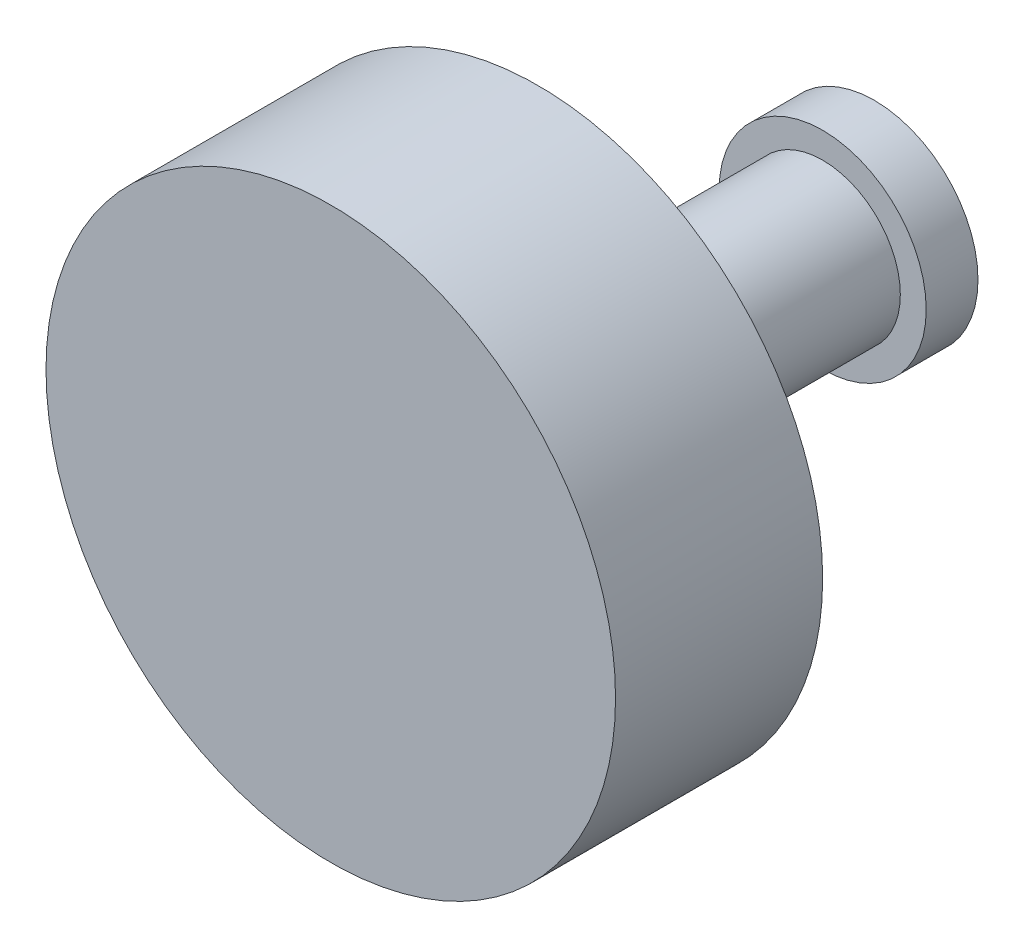
ISO-10303-21;
HEADER;
FILE_DESCRIPTION(('STEP AP214'),'2;1');
FILE_NAME('part.step','',(''),(''),'','','');
FILE_SCHEMA(('AUTOMOTIVE_DESIGN { 1 0 10303 214 1 1 1 1 }'));
ENDSEC;
DATA;
#1=APPLICATION_CONTEXT('core data for automotive mechanical design processes');
#2=APPLICATION_PROTOCOL_DEFINITION('international standard','automotive_design',2000,#1);
#3=PRODUCT_CONTEXT('',#1,'mechanical');
#4=PRODUCT('Part','Part','',(#3));
#5=PRODUCT_RELATED_PRODUCT_CATEGORY('part','',(#4));
#6=PRODUCT_DEFINITION_FORMATION('','',#4);
#7=PRODUCT_DEFINITION_CONTEXT('part definition',#1,'design');
#8=PRODUCT_DEFINITION('design','',#6,#7);
#9=PRODUCT_DEFINITION_SHAPE('','',#8);
#10=(LENGTH_UNIT() NAMED_UNIT(*) SI_UNIT(.MILLI.,.METRE.));
#11=(NAMED_UNIT(*) PLANE_ANGLE_UNIT() SI_UNIT($,.RADIAN.));
#12=(NAMED_UNIT(*) SI_UNIT($,.STERADIAN.) SOLID_ANGLE_UNIT());
#13=UNCERTAINTY_MEASURE_WITH_UNIT(LENGTH_MEASURE(1.E-05),#10,'distance_accuracy_value','');
#14=(GEOMETRIC_REPRESENTATION_CONTEXT(3) GLOBAL_UNCERTAINTY_ASSIGNED_CONTEXT((#13)) GLOBAL_UNIT_ASSIGNED_CONTEXT((#10,
#11,#12)) REPRESENTATION_CONTEXT('',''));
#15=CARTESIAN_POINT('',(0.,0.,0.));
#16=DIRECTION('',(0.,0.,1.));
#17=DIRECTION('',(1.,0.,0.));
#18=AXIS2_PLACEMENT_3D('',#15,#16,#17);
#19=CARTESIAN_POINT('',(0.,0.,0.));
#20=DIRECTION('',(0.,0.,1.));
#21=DIRECTION('',(1.,0.,0.));
#22=AXIS2_PLACEMENT_3D('',#19,#20,#21);
#23=PLANE('',#22);
#24=CARTESIAN_POINT('',(0.,0.,0.));
#25=DIRECTION('',(0.,0.,1.));
#26=DIRECTION('',(1.,0.,0.));
#27=AXIS2_PLACEMENT_3D('',#24,#25,#26);
#28=CIRCLE('',#27,37.95);
#29=CARTESIAN_POINT('',(37.95,0.,0.));
#30=VERTEX_POINT('',#29);
#31=EDGE_CURVE('E42',#30,#30,#28,.T.);
#32=ORIENTED_EDGE('',*,*,#31,.F.);
#33=EDGE_LOOP('',(#32));
#34=FACE_BOUND('',#33,.T.);
#35=CARTESIAN_POINT('',(0.,0.,0.));
#36=DIRECTION('',(0.,0.,1.));
#37=DIRECTION('',(1.,0.,0.));
#38=AXIS2_PLACEMENT_3D('',#35,#36,#37);
#39=CIRCLE('',#38,10.35);
#40=CARTESIAN_POINT('',(10.35,0.,0.));
#41=VERTEX_POINT('',#40);
#42=EDGE_CURVE('E10',#41,#41,#39,.F.);
#43=ORIENTED_EDGE('',*,*,#42,.F.);
#44=EDGE_LOOP('',(#43));
#45=FACE_BOUND('',#44,.T.);
#46=ADVANCED_FACE('F31',(#34,#45),#23,.F.);
#47=CARTESIAN_POINT('',(0.,0.,27.6));
#48=DIRECTION('',(0.,0.,-1.));
#49=DIRECTION('',(-1.,0.,0.));
#50=AXIS2_PLACEMENT_3D('',#47,#48,#49);
#51=CYLINDRICAL_SURFACE('',#50,37.95);
#52=CARTESIAN_POINT('',(0.,0.,27.6));
#53=DIRECTION('',(0.,0.,1.));
#54=DIRECTION('',(1.,0.,0.));
#55=AXIS2_PLACEMENT_3D('',#52,#53,#54);
#56=CIRCLE('',#55,37.95);
#57=CARTESIAN_POINT('',(37.95,0.,27.6));
#58=VERTEX_POINT('',#57);
#59=EDGE_CURVE('E38',#58,#58,#56,.T.);
#60=ORIENTED_EDGE('',*,*,#59,.F.);
#61=EDGE_LOOP('',(#60));
#62=FACE_BOUND('',#61,.T.);
#63=ORIENTED_EDGE('',*,*,#31,.T.);
#64=EDGE_LOOP('',(#63));
#65=FACE_BOUND('',#64,.T.);
#66=ADVANCED_FACE('F33',(#62,#65),#51,.T.);
#67=CARTESIAN_POINT('',(0.,0.,27.6));
#68=DIRECTION('',(0.,0.,1.));
#69=DIRECTION('',(1.,0.,0.));
#70=AXIS2_PLACEMENT_3D('',#67,#68,#69);
#71=PLANE('',#70);
#72=ORIENTED_EDGE('',*,*,#59,.T.);
#73=EDGE_LOOP('',(#72));
#74=FACE_BOUND('',#73,.T.);
#75=ADVANCED_FACE('F74',(#74),#71,.T.);
#76=CARTESIAN_POINT('',(0.,0.,-37.95));
#77=DIRECTION('',(0.,0.,1.));
#78=DIRECTION('',(1.,0.,0.));
#79=AXIS2_PLACEMENT_3D('',#76,#77,#78);
#80=CYLINDRICAL_SURFACE('',#79,10.35);
#81=CARTESIAN_POINT('',(0.,0.,-37.95));
#82=DIRECTION('',(0.,0.,-1.));
#83=DIRECTION('',(-1.,0.,0.));
#84=AXIS2_PLACEMENT_3D('',#81,#82,#83);
#85=CIRCLE('',#84,10.35);
#86=CARTESIAN_POINT('',(-10.35,0.,-37.95));
#87=VERTEX_POINT('',#86);
#88=EDGE_CURVE('E47',#87,#87,#85,.T.);
#89=ORIENTED_EDGE('',*,*,#88,.F.);
#90=EDGE_LOOP('',(#89));
#91=FACE_BOUND('',#90,.T.);
#92=ORIENTED_EDGE('',*,*,#42,.T.);
#93=EDGE_LOOP('',(#92));
#94=FACE_BOUND('',#93,.T.);
#95=ADVANCED_FACE('F69',(#91,#94),#80,.T.);
#96=CARTESIAN_POINT('',(0.,0.,-37.95));
#97=DIRECTION('',(0.,0.,-1.));
#98=DIRECTION('',(-1.,0.,0.));
#99=AXIS2_PLACEMENT_3D('',#96,#97,#98);
#100=PLANE('',#99);
#101=CARTESIAN_POINT('',(0.,0.,-37.95));
#102=DIRECTION('',(0.,0.,-1.));
#103=DIRECTION('',(-1.,0.,0.));
#104=AXIS2_PLACEMENT_3D('',#101,#102,#103);
#105=CIRCLE('',#104,13.8);
#106=CARTESIAN_POINT('',(-13.8,0.,-37.95));
#107=VERTEX_POINT('',#106);
#108=EDGE_CURVE('E52',#107,#107,#105,.T.);
#109=ORIENTED_EDGE('',*,*,#108,.F.);
#110=EDGE_LOOP('',(#109));
#111=FACE_BOUND('',#110,.T.);
#112=ORIENTED_EDGE('',*,*,#88,.T.);
#113=EDGE_LOOP('',(#112));
#114=FACE_BOUND('',#113,.T.);
#115=ADVANCED_FACE('F63',(#111,#114),#100,.F.);
#116=CARTESIAN_POINT('',(0.,0.,-44.85));
#117=DIRECTION('',(0.,0.,1.));
#118=DIRECTION('',(1.,0.,0.));
#119=AXIS2_PLACEMENT_3D('',#116,#117,#118);
#120=CYLINDRICAL_SURFACE('',#119,13.8);
#121=CARTESIAN_POINT('',(0.,0.,-44.85));
#122=DIRECTION('',(0.,0.,-1.));
#123=DIRECTION('',(-1.,0.,0.));
#124=AXIS2_PLACEMENT_3D('',#121,#122,#123);
#125=CIRCLE('',#124,13.8);
#126=CARTESIAN_POINT('',(-13.8,0.,-44.85));
#127=VERTEX_POINT('',#126);
#128=EDGE_CURVE('E51',#127,#127,#125,.T.);
#129=ORIENTED_EDGE('',*,*,#128,.F.);
#130=EDGE_LOOP('',(#129));
#131=FACE_BOUND('',#130,.T.);
#132=ORIENTED_EDGE('',*,*,#108,.T.);
#133=EDGE_LOOP('',(#132));
#134=FACE_BOUND('',#133,.T.);
#135=ADVANCED_FACE('F60',(#131,#134),#120,.T.);
#136=CARTESIAN_POINT('',(0.,0.,-44.85));
#137=DIRECTION('',(0.,0.,-1.));
#138=DIRECTION('',(-1.,0.,0.));
#139=AXIS2_PLACEMENT_3D('',#136,#137,#138);
#140=PLANE('',#139);
#141=ORIENTED_EDGE('',*,*,#128,.T.);
#142=EDGE_LOOP('',(#141));
#143=FACE_BOUND('',#142,.T.);
#144=ADVANCED_FACE('F58',(#143),#140,.T.);
#145=CLOSED_SHELL('',(#46,#66,#75,#95,#115,#135,#144));
#146=MANIFOLD_SOLID_BREP('B2',#145);
#147=ADVANCED_BREP_SHAPE_REPRESENTATION('',(#18,#146),#14);
#148=SHAPE_DEFINITION_REPRESENTATION(#9,#147);
ENDSEC;
END-ISO-10303-21;
